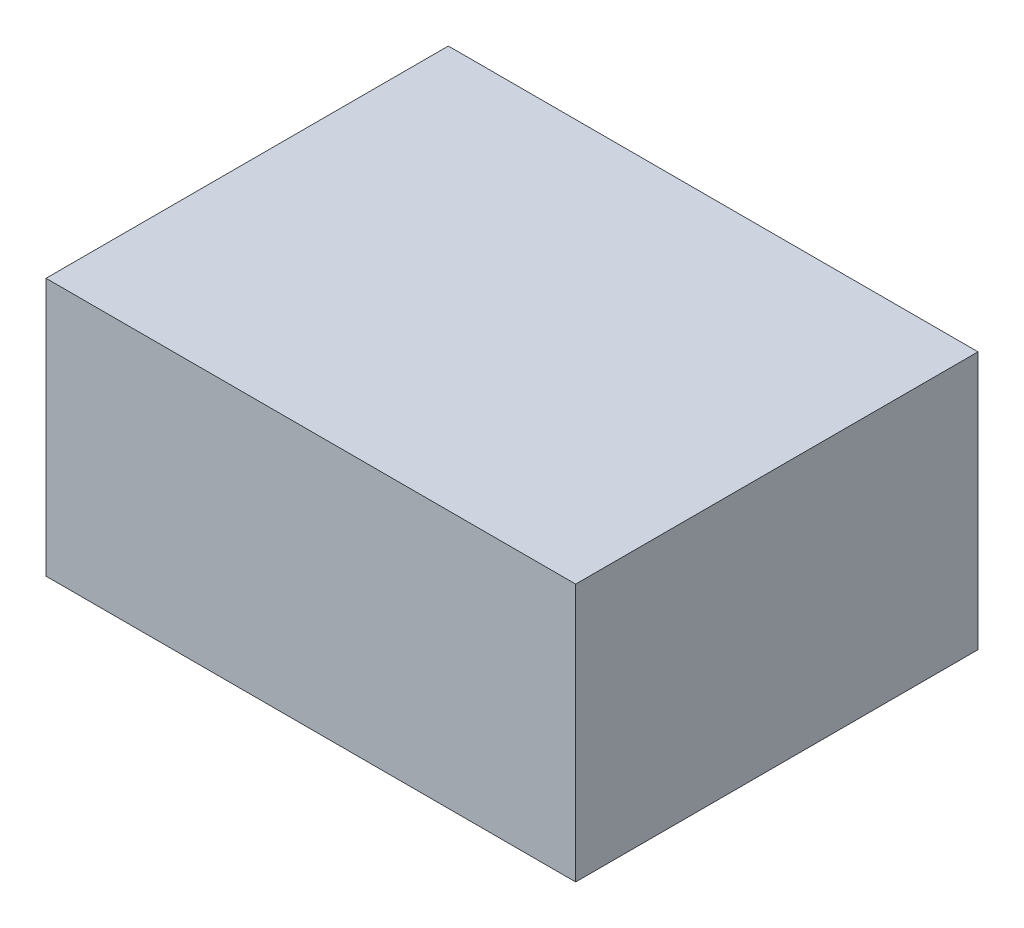
ISO-10303-21;
HEADER;
FILE_DESCRIPTION(('STEP AP214'),'2;1');
FILE_NAME('part.step','',(''),(''),'','','');
FILE_SCHEMA(('AUTOMOTIVE_DESIGN { 1 0 10303 214 1 1 1 1 }'));
ENDSEC;
DATA;
#1=APPLICATION_CONTEXT('core data for automotive mechanical design processes');
#2=APPLICATION_PROTOCOL_DEFINITION('international standard','automotive_design',2000,#1);
#3=PRODUCT_CONTEXT('',#1,'mechanical');
#4=PRODUCT('Part','Part','',(#3));
#5=PRODUCT_RELATED_PRODUCT_CATEGORY('part','',(#4));
#6=PRODUCT_DEFINITION_FORMATION('','',#4);
#7=PRODUCT_DEFINITION_CONTEXT('part definition',#1,'design');
#8=PRODUCT_DEFINITION('design','',#6,#7);
#9=PRODUCT_DEFINITION_SHAPE('','',#8);
#10=(LENGTH_UNIT() NAMED_UNIT(*) SI_UNIT(.MILLI.,.METRE.));
#11=(NAMED_UNIT(*) PLANE_ANGLE_UNIT() SI_UNIT($,.RADIAN.));
#12=(NAMED_UNIT(*) SI_UNIT($,.STERADIAN.) SOLID_ANGLE_UNIT());
#13=UNCERTAINTY_MEASURE_WITH_UNIT(LENGTH_MEASURE(1.E-05),#10,'distance_accuracy_value','');
#14=(GEOMETRIC_REPRESENTATION_CONTEXT(3) GLOBAL_UNCERTAINTY_ASSIGNED_CONTEXT((#13)) GLOBAL_UNIT_ASSIGNED_CONTEXT((#10,
#11,#12)) REPRESENTATION_CONTEXT('',''));
#15=CARTESIAN_POINT('',(0.,0.,0.));
#16=DIRECTION('',(0.,0.,1.));
#17=DIRECTION('',(1.,0.,0.));
#18=AXIS2_PLACEMENT_3D('',#15,#16,#17);
#19=CARTESIAN_POINT('',(42.13,20.52,-32.));
#20=DIRECTION('',(0.,0.,1.));
#21=DIRECTION('',(1.,0.,0.));
#22=AXIS2_PLACEMENT_3D('',#19,#20,#21);
#23=PLANE('',#22);
#24=DIRECTION('',(-1.,0.,0.));
#25=VECTOR('',#24,1.);
#26=CARTESIAN_POINT('',(42.13,0.,-32.));
#27=LINE('',#26,#25);
#28=CARTESIAN_POINT('',(42.13,0.,-32.));
#29=VERTEX_POINT('',#28);
#30=CARTESIAN_POINT('',(0.,0.,-32.));
#31=VERTEX_POINT('',#30);
#32=EDGE_CURVE('E100',#29,#31,#27,.T.);
#33=ORIENTED_EDGE('',*,*,#32,.T.);
#34=DIRECTION('',(0.,-1.,0.));
#35=VECTOR('',#34,1.);
#36=CARTESIAN_POINT('',(0.,20.52,-32.));
#37=LINE('',#36,#35);
#38=CARTESIAN_POINT('',(0.,20.52,-32.));
#39=VERTEX_POINT('',#38);
#40=EDGE_CURVE('E11',#39,#31,#37,.T.);
#41=ORIENTED_EDGE('',*,*,#40,.F.);
#42=DIRECTION('',(-1.,0.,0.));
#43=VECTOR('',#42,1.);
#44=CARTESIAN_POINT('',(42.13,20.52,-32.));
#45=LINE('',#44,#43);
#46=CARTESIAN_POINT('',(42.13,20.52,-32.));
#47=VERTEX_POINT('',#46);
#48=EDGE_CURVE('E88',#47,#39,#45,.T.);
#49=ORIENTED_EDGE('',*,*,#48,.F.);
#50=DIRECTION('',(0.,-1.,0.));
#51=VECTOR('',#50,1.);
#52=CARTESIAN_POINT('',(42.13,20.52,-32.));
#53=LINE('',#52,#51);
#54=EDGE_CURVE('E96',#47,#29,#53,.T.);
#55=ORIENTED_EDGE('',*,*,#54,.T.);
#56=EDGE_LOOP('',(#33,#41,#49,#55));
#57=FACE_BOUND('',#56,.T.);
#58=ADVANCED_FACE('F37',(#57),#23,.F.);
#59=CARTESIAN_POINT('',(0.,20.52,-32.));
#60=DIRECTION('',(1.,0.,0.));
#61=DIRECTION('',(0.,0.,-1.));
#62=AXIS2_PLACEMENT_3D('',#59,#60,#61);
#63=PLANE('',#62);
#64=DIRECTION('',(0.,0.,1.));
#65=VECTOR('',#64,1.);
#66=CARTESIAN_POINT('',(0.,0.,-32.));
#67=LINE('',#66,#65);
#68=CARTESIAN_POINT('',(0.,0.,0.));
#69=VERTEX_POINT('',#68);
#70=EDGE_CURVE('E92',#31,#69,#67,.T.);
#71=ORIENTED_EDGE('',*,*,#70,.T.);
#72=DIRECTION('',(0.,-1.,0.));
#73=VECTOR('',#72,1.);
#74=CARTESIAN_POINT('',(0.,20.52,0.));
#75=LINE('',#74,#73);
#76=CARTESIAN_POINT('',(0.,20.52,0.));
#77=VERTEX_POINT('',#76);
#78=EDGE_CURVE('E45',#77,#69,#75,.T.);
#79=ORIENTED_EDGE('',*,*,#78,.F.);
#80=DIRECTION('',(0.,0.,1.));
#81=VECTOR('',#80,1.);
#82=CARTESIAN_POINT('',(0.,20.52,-32.));
#83=LINE('',#82,#81);
#84=EDGE_CURVE('E83',#39,#77,#83,.T.);
#85=ORIENTED_EDGE('',*,*,#84,.F.);
#86=ORIENTED_EDGE('',*,*,#40,.T.);
#87=EDGE_LOOP('',(#71,#79,#85,#86));
#88=FACE_BOUND('',#87,.T.);
#89=ADVANCED_FACE('F91',(#88),#63,.F.);
#90=CARTESIAN_POINT('',(0.,20.52,0.));
#91=DIRECTION('',(0.,0.,-1.));
#92=DIRECTION('',(-1.,0.,0.));
#93=AXIS2_PLACEMENT_3D('',#90,#91,#92);
#94=PLANE('',#93);
#95=DIRECTION('',(1.,0.,0.));
#96=VECTOR('',#95,1.);
#97=CARTESIAN_POINT('',(0.,0.,0.));
#98=LINE('',#97,#96);
#99=CARTESIAN_POINT('',(42.13,0.,0.));
#100=VERTEX_POINT('',#99);
#101=EDGE_CURVE('E70',#69,#100,#98,.T.);
#102=ORIENTED_EDGE('',*,*,#101,.T.);
#103=DIRECTION('',(0.,-1.,0.));
#104=VECTOR('',#103,1.);
#105=CARTESIAN_POINT('',(42.13,20.52,0.));
#106=LINE('',#105,#104);
#107=CARTESIAN_POINT('',(42.13,20.52,0.));
#108=VERTEX_POINT('',#107);
#109=EDGE_CURVE('E93',#108,#100,#106,.T.);
#110=ORIENTED_EDGE('',*,*,#109,.F.);
#111=DIRECTION('',(1.,0.,0.));
#112=VECTOR('',#111,1.);
#113=CARTESIAN_POINT('',(0.,20.52,0.));
#114=LINE('',#113,#112);
#115=EDGE_CURVE('E86',#77,#108,#114,.T.);
#116=ORIENTED_EDGE('',*,*,#115,.F.);
#117=ORIENTED_EDGE('',*,*,#78,.T.);
#118=EDGE_LOOP('',(#102,#110,#116,#117));
#119=FACE_BOUND('',#118,.T.);
#120=ADVANCED_FACE('F94',(#119),#94,.F.);
#121=CARTESIAN_POINT('',(42.13,20.52,0.));
#122=DIRECTION('',(-1.,0.,0.));
#123=DIRECTION('',(0.,0.,1.));
#124=AXIS2_PLACEMENT_3D('',#121,#122,#123);
#125=PLANE('',#124);
#126=DIRECTION('',(0.,0.,-1.));
#127=VECTOR('',#126,1.);
#128=CARTESIAN_POINT('',(42.13,0.,0.));
#129=LINE('',#128,#127);
#130=EDGE_CURVE('E76',#100,#29,#129,.T.);
#131=ORIENTED_EDGE('',*,*,#130,.T.);
#132=ORIENTED_EDGE('',*,*,#54,.F.);
#133=DIRECTION('',(0.,0.,-1.));
#134=VECTOR('',#133,1.);
#135=CARTESIAN_POINT('',(42.13,20.52,0.));
#136=LINE('',#135,#134);
#137=EDGE_CURVE('E53',#108,#47,#136,.T.);
#138=ORIENTED_EDGE('',*,*,#137,.F.);
#139=ORIENTED_EDGE('',*,*,#109,.T.);
#140=EDGE_LOOP('',(#131,#132,#138,#139));
#141=FACE_BOUND('',#140,.T.);
#142=ADVANCED_FACE('F107',(#141),#125,.F.);
#143=CARTESIAN_POINT('',(0.,20.52,0.));
#144=DIRECTION('',(0.,1.,0.));
#145=DIRECTION('',(0.,0.,1.));
#146=AXIS2_PLACEMENT_3D('',#143,#144,#145);
#147=PLANE('',#146);
#148=ORIENTED_EDGE('',*,*,#48,.T.);
#149=ORIENTED_EDGE('',*,*,#84,.T.);
#150=ORIENTED_EDGE('',*,*,#115,.T.);
#151=ORIENTED_EDGE('',*,*,#137,.T.);
#152=EDGE_LOOP('',(#148,#149,#150,#151));
#153=FACE_BOUND('',#152,.T.);
#154=ADVANCED_FACE('F84',(#153),#147,.T.);
#155=CARTESIAN_POINT('',(0.,0.,0.));
#156=DIRECTION('',(0.,1.,0.));
#157=DIRECTION('',(0.,0.,1.));
#158=AXIS2_PLACEMENT_3D('',#155,#156,#157);
#159=PLANE('',#158);
#160=ORIENTED_EDGE('',*,*,#32,.F.);
#161=ORIENTED_EDGE('',*,*,#130,.F.);
#162=ORIENTED_EDGE('',*,*,#101,.F.);
#163=ORIENTED_EDGE('',*,*,#70,.F.);
#164=EDGE_LOOP('',(#160,#161,#162,#163));
#165=FACE_BOUND('',#164,.T.);
#166=ADVANCED_FACE('F110',(#165),#159,.F.);
#167=CLOSED_SHELL('',(#58,#89,#120,#142,#154,#166));
#168=MANIFOLD_SOLID_BREP('B2',#167);
#169=ADVANCED_BREP_SHAPE_REPRESENTATION('',(#18,#168),#14);
#170=SHAPE_DEFINITION_REPRESENTATION(#9,#169);
ENDSEC;
END-ISO-10303-21;
